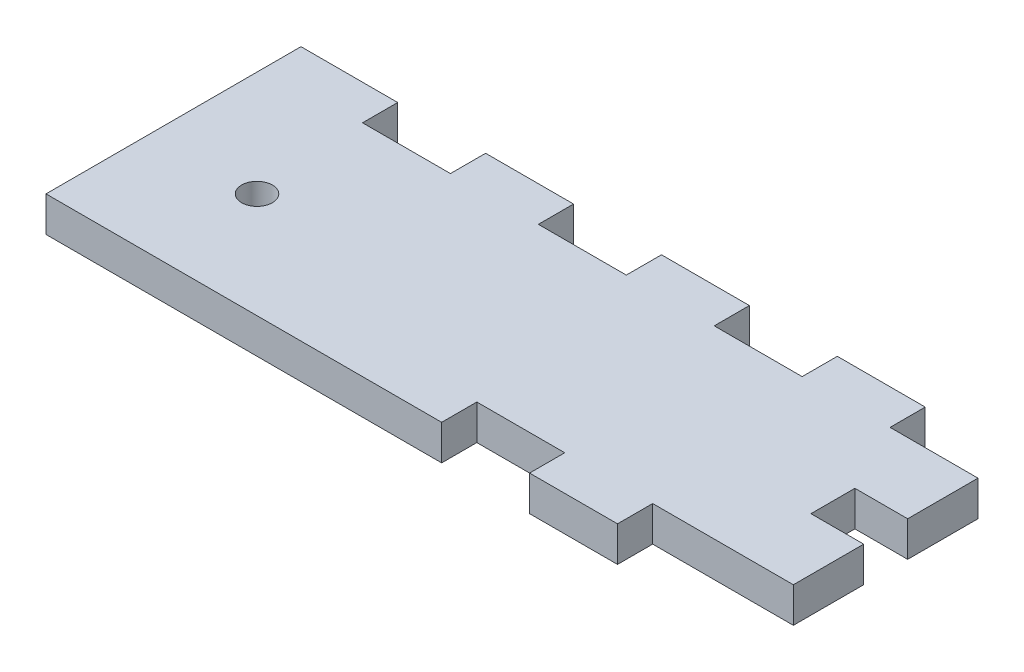
ISO-10303-21;
HEADER;
FILE_DESCRIPTION(('STEP AP214'),'2;1');
FILE_NAME('part.step','',(''),(''),'','','');
FILE_SCHEMA(('AUTOMOTIVE_DESIGN { 1 0 10303 214 1 1 1 1 }'));
ENDSEC;
DATA;
#1=APPLICATION_CONTEXT('core data for automotive mechanical design processes');
#2=APPLICATION_PROTOCOL_DEFINITION('international standard','automotive_design',2000,#1);
#3=PRODUCT_CONTEXT('',#1,'mechanical');
#4=PRODUCT('Part','Part','',(#3));
#5=PRODUCT_RELATED_PRODUCT_CATEGORY('part','',(#4));
#6=PRODUCT_DEFINITION_FORMATION('','',#4);
#7=PRODUCT_DEFINITION_CONTEXT('part definition',#1,'design');
#8=PRODUCT_DEFINITION('design','',#6,#7);
#9=PRODUCT_DEFINITION_SHAPE('','',#8);
#10=(LENGTH_UNIT() NAMED_UNIT(*) SI_UNIT(.MILLI.,.METRE.));
#11=(NAMED_UNIT(*) PLANE_ANGLE_UNIT() SI_UNIT($,.RADIAN.));
#12=(NAMED_UNIT(*) SI_UNIT($,.STERADIAN.) SOLID_ANGLE_UNIT());
#13=UNCERTAINTY_MEASURE_WITH_UNIT(LENGTH_MEASURE(1.E-05),#10,'distance_accuracy_value','');
#14=(GEOMETRIC_REPRESENTATION_CONTEXT(3) GLOBAL_UNCERTAINTY_ASSIGNED_CONTEXT((#13)) GLOBAL_UNIT_ASSIGNED_CONTEXT((#10,
#11,#12)) REPRESENTATION_CONTEXT('',''));
#15=CARTESIAN_POINT('',(0.,0.,0.));
#16=DIRECTION('',(0.,0.,1.));
#17=DIRECTION('',(1.,0.,0.));
#18=AXIS2_PLACEMENT_3D('',#15,#16,#17);
#19=CARTESIAN_POINT('',(0.,4.,21.));
#20=DIRECTION('',(0.,0.,-1.));
#21=DIRECTION('',(-1.,0.,0.));
#22=AXIS2_PLACEMENT_3D('',#19,#20,#21);
#23=PLANE('',#22);
#24=DIRECTION('',(1.,0.,0.));
#25=VECTOR('',#24,1.);
#26=CARTESIAN_POINT('',(0.,0.,21.));
#27=LINE('',#26,#25);
#28=CARTESIAN_POINT('',(45.,0.,21.));
#29=VERTEX_POINT('',#28);
#30=CARTESIAN_POINT('',(55.,0.,21.));
#31=VERTEX_POINT('',#30);
#32=EDGE_CURVE('E430',#29,#31,#27,.T.);
#33=ORIENTED_EDGE('',*,*,#32,.T.);
#34=DIRECTION('',(0.,1.,0.));
#35=VECTOR('',#34,1.);
#36=CARTESIAN_POINT('',(55.,0.,21.));
#37=LINE('',#36,#35);
#38=CARTESIAN_POINT('',(55.,4.,21.));
#39=VERTEX_POINT('',#38);
#40=EDGE_CURVE('E61',#31,#39,#37,.T.);
#41=ORIENTED_EDGE('',*,*,#40,.T.);
#42=DIRECTION('',(1.,0.,0.));
#43=VECTOR('',#42,1.);
#44=CARTESIAN_POINT('',(0.,4.,21.));
#45=LINE('',#44,#43);
#46=CARTESIAN_POINT('',(45.,4.,21.));
#47=VERTEX_POINT('',#46);
#48=EDGE_CURVE('E423',#47,#39,#45,.T.);
#49=ORIENTED_EDGE('',*,*,#48,.F.);
#50=DIRECTION('',(0.,1.,0.));
#51=VECTOR('',#50,1.);
#52=CARTESIAN_POINT('',(45.,0.,21.));
#53=LINE('',#52,#51);
#54=EDGE_CURVE('E276',#29,#47,#53,.T.);
#55=ORIENTED_EDGE('',*,*,#54,.F.);
#56=EDGE_LOOP('',(#33,#41,#49,#55));
#57=FACE_BOUND('',#56,.T.);
#58=ADVANCED_FACE('F35',(#57),#23,.F.);
#59=CARTESIAN_POINT('',(65.,4.,21.));
#60=VERTEX_POINT('',#59);
#61=CARTESIAN_POINT('',(81.,4.,21.));
#62=VERTEX_POINT('',#61);
#63=EDGE_CURVE('E53',#60,#62,#45,.T.);
#64=ORIENTED_EDGE('',*,*,#63,.F.);
#65=DIRECTION('',(0.,1.,0.));
#66=VECTOR('',#65,1.);
#67=CARTESIAN_POINT('',(65.,0.,21.));
#68=LINE('',#67,#66);
#69=CARTESIAN_POINT('',(65.,0.,21.));
#70=VERTEX_POINT('',#69);
#71=EDGE_CURVE('E261',#70,#60,#68,.T.);
#72=ORIENTED_EDGE('',*,*,#71,.F.);
#73=CARTESIAN_POINT('',(81.,0.,21.));
#74=VERTEX_POINT('',#73);
#75=EDGE_CURVE('E429',#70,#74,#27,.T.);
#76=ORIENTED_EDGE('',*,*,#75,.T.);
#77=DIRECTION('',(0.,-1.,0.));
#78=VECTOR('',#77,1.);
#79=CARTESIAN_POINT('',(81.,4.,21.));
#80=LINE('',#79,#78);
#81=EDGE_CURVE('E402',#62,#74,#80,.T.);
#82=ORIENTED_EDGE('',*,*,#81,.F.);
#83=EDGE_LOOP('',(#64,#72,#76,#82));
#84=FACE_BOUND('',#83,.T.);
#85=ADVANCED_FACE('F516',(#84),#23,.F.);
#86=CARTESIAN_POINT('',(0.,4.,0.));
#87=DIRECTION('',(0.,0.,1.));
#88=DIRECTION('',(1.,0.,0.));
#89=AXIS2_PLACEMENT_3D('',#86,#87,#88);
#90=PLANE('',#89);
#91=DIRECTION('',(-1.,0.,0.));
#92=VECTOR('',#91,1.);
#93=CARTESIAN_POINT('',(0.,0.,0.));
#94=LINE('',#93,#92);
#95=CARTESIAN_POINT('',(21.,0.,0.));
#96=VERTEX_POINT('',#95);
#97=CARTESIAN_POINT('',(11.,0.,0.));
#98=VERTEX_POINT('',#97);
#99=EDGE_CURVE('E432',#96,#98,#94,.T.);
#100=ORIENTED_EDGE('',*,*,#99,.T.);
#101=DIRECTION('',(0.,1.,0.));
#102=VECTOR('',#101,1.);
#103=CARTESIAN_POINT('',(11.,0.,0.));
#104=LINE('',#103,#102);
#105=CARTESIAN_POINT('',(11.,4.,0.));
#106=VERTEX_POINT('',#105);
#107=EDGE_CURVE('E299',#98,#106,#104,.T.);
#108=ORIENTED_EDGE('',*,*,#107,.T.);
#109=DIRECTION('',(-1.,0.,0.));
#110=VECTOR('',#109,1.);
#111=CARTESIAN_POINT('',(0.,4.,0.));
#112=LINE('',#111,#110);
#113=CARTESIAN_POINT('',(21.,4.,0.));
#114=VERTEX_POINT('',#113);
#115=EDGE_CURVE('E46',#114,#106,#112,.T.);
#116=ORIENTED_EDGE('',*,*,#115,.F.);
#117=DIRECTION('',(0.,1.,0.));
#118=VECTOR('',#117,1.);
#119=CARTESIAN_POINT('',(21.,0.,0.));
#120=LINE('',#119,#118);
#121=EDGE_CURVE('E324',#96,#114,#120,.T.);
#122=ORIENTED_EDGE('',*,*,#121,.F.);
#123=EDGE_LOOP('',(#100,#108,#116,#122));
#124=FACE_BOUND('',#123,.T.);
#125=ADVANCED_FACE('F490',(#124),#90,.F.);
#126=CARTESIAN_POINT('',(41.,0.,0.));
#127=VERTEX_POINT('',#126);
#128=CARTESIAN_POINT('',(31.,0.,0.));
#129=VERTEX_POINT('',#128);
#130=EDGE_CURVE('E435',#127,#129,#94,.T.);
#131=ORIENTED_EDGE('',*,*,#130,.T.);
#132=DIRECTION('',(0.,1.,0.));
#133=VECTOR('',#132,1.);
#134=CARTESIAN_POINT('',(31.,0.,0.));
#135=LINE('',#134,#133);
#136=CARTESIAN_POINT('',(31.,4.,0.));
#137=VERTEX_POINT('',#136);
#138=EDGE_CURVE('E321',#129,#137,#135,.T.);
#139=ORIENTED_EDGE('',*,*,#138,.T.);
#140=CARTESIAN_POINT('',(41.,4.,0.));
#141=VERTEX_POINT('',#140);
#142=EDGE_CURVE('E464',#141,#137,#112,.T.);
#143=ORIENTED_EDGE('',*,*,#142,.F.);
#144=DIRECTION('',(0.,1.,0.));
#145=VECTOR('',#144,1.);
#146=CARTESIAN_POINT('',(41.,0.,0.));
#147=LINE('',#146,#145);
#148=EDGE_CURVE('E351',#127,#141,#147,.T.);
#149=ORIENTED_EDGE('',*,*,#148,.F.);
#150=EDGE_LOOP('',(#131,#139,#143,#149));
#151=FACE_BOUND('',#150,.T.);
#152=ADVANCED_FACE('F501',(#151),#90,.F.);
#153=CARTESIAN_POINT('',(61.,0.,0.));
#154=VERTEX_POINT('',#153);
#155=CARTESIAN_POINT('',(51.,0.,0.));
#156=VERTEX_POINT('',#155);
#157=EDGE_CURVE('E439',#154,#156,#94,.T.);
#158=ORIENTED_EDGE('',*,*,#157,.T.);
#159=DIRECTION('',(0.,1.,0.));
#160=VECTOR('',#159,1.);
#161=CARTESIAN_POINT('',(51.,0.,0.));
#162=LINE('',#161,#160);
#163=CARTESIAN_POINT('',(51.,4.,0.));
#164=VERTEX_POINT('',#163);
#165=EDGE_CURVE('E348',#156,#164,#162,.T.);
#166=ORIENTED_EDGE('',*,*,#165,.T.);
#167=CARTESIAN_POINT('',(61.,4.,0.));
#168=VERTEX_POINT('',#167);
#169=EDGE_CURVE('E44',#168,#164,#112,.T.);
#170=ORIENTED_EDGE('',*,*,#169,.F.);
#171=DIRECTION('',(0.,1.,0.));
#172=VECTOR('',#171,1.);
#173=CARTESIAN_POINT('',(61.,0.,0.));
#174=LINE('',#173,#172);
#175=EDGE_CURVE('E378',#154,#168,#174,.T.);
#176=ORIENTED_EDGE('',*,*,#175,.F.);
#177=EDGE_LOOP('',(#158,#166,#170,#176));
#178=FACE_BOUND('',#177,.T.);
#179=ADVANCED_FACE('F447',(#178),#90,.F.);
#180=CARTESIAN_POINT('',(75.,4.,0.));
#181=DIRECTION('',(-1.,0.,0.));
#182=DIRECTION('',(0.,0.,1.));
#183=AXIS2_PLACEMENT_3D('',#180,#181,#182);
#184=PLANE('',#183);
#185=DIRECTION('',(0.,-1.,0.));
#186=VECTOR('',#185,1.);
#187=CARTESIAN_POINT('',(75.,4.,8.));
#188=LINE('',#187,#186);
#189=CARTESIAN_POINT('',(75.,4.,8.));
#190=VERTEX_POINT('',#189);
#191=CARTESIAN_POINT('',(75.,0.,8.));
#192=VERTEX_POINT('',#191);
#193=EDGE_CURVE('E377',#190,#192,#188,.T.);
#194=ORIENTED_EDGE('',*,*,#193,.F.);
#195=DIRECTION('',(0.,0.,-1.));
#196=VECTOR('',#195,1.);
#197=CARTESIAN_POINT('',(75.,4.,0.));
#198=LINE('',#197,#196);
#199=CARTESIAN_POINT('',(75.,4.,13.));
#200=VERTEX_POINT('',#199);
#201=EDGE_CURVE('E425',#200,#190,#198,.T.);
#202=ORIENTED_EDGE('',*,*,#201,.F.);
#203=DIRECTION('',(0.,1.,0.));
#204=VECTOR('',#203,1.);
#205=CARTESIAN_POINT('',(75.,4.,13.));
#206=LINE('',#205,#204);
#207=CARTESIAN_POINT('',(75.,0.,13.));
#208=VERTEX_POINT('',#207);
#209=EDGE_CURVE('E401',#208,#200,#206,.T.);
#210=ORIENTED_EDGE('',*,*,#209,.F.);
#211=DIRECTION('',(0.,0.,-1.));
#212=VECTOR('',#211,1.);
#213=CARTESIAN_POINT('',(75.,0.,0.));
#214=LINE('',#213,#212);
#215=EDGE_CURVE('E431',#208,#192,#214,.T.);
#216=ORIENTED_EDGE('',*,*,#215,.T.);
#217=EDGE_LOOP('',(#194,#202,#210,#216));
#218=FACE_BOUND('',#217,.T.);
#219=ADVANCED_FACE('F522',(#218),#184,.F.);
#220=CARTESIAN_POINT('',(0.,4.,0.));
#221=DIRECTION('',(1.,0.,0.));
#222=DIRECTION('',(0.,0.,-1.));
#223=AXIS2_PLACEMENT_3D('',#220,#221,#222);
#224=PLANE('',#223);
#225=DIRECTION('',(0.,0.,1.));
#226=VECTOR('',#225,1.);
#227=CARTESIAN_POINT('',(0.,0.,0.));
#228=LINE('',#227,#226);
#229=CARTESIAN_POINT('',(0.,0.,-4.));
#230=VERTEX_POINT('',#229);
#231=CARTESIAN_POINT('',(0.,0.,25.));
#232=VERTEX_POINT('',#231);
#233=EDGE_CURVE('E420',#230,#232,#228,.T.);
#234=ORIENTED_EDGE('',*,*,#233,.T.);
#235=DIRECTION('',(0.,1.,0.));
#236=VECTOR('',#235,1.);
#237=CARTESIAN_POINT('',(0.,0.,25.));
#238=LINE('',#237,#236);
#239=CARTESIAN_POINT('',(0.,4.,25.));
#240=VERTEX_POINT('',#239);
#241=EDGE_CURVE('E271',#232,#240,#238,.T.);
#242=ORIENTED_EDGE('',*,*,#241,.T.);
#243=DIRECTION('',(0.,0.,1.));
#244=VECTOR('',#243,1.);
#245=CARTESIAN_POINT('',(0.,4.,0.));
#246=LINE('',#245,#244);
#247=CARTESIAN_POINT('',(0.,4.,-4.));
#248=VERTEX_POINT('',#247);
#249=EDGE_CURVE('E421',#248,#240,#246,.T.);
#250=ORIENTED_EDGE('',*,*,#249,.F.);
#251=DIRECTION('',(0.,1.,0.));
#252=VECTOR('',#251,1.);
#253=CARTESIAN_POINT('',(0.,0.,-4.));
#254=LINE('',#253,#252);
#255=EDGE_CURVE('E279',#230,#248,#254,.T.);
#256=ORIENTED_EDGE('',*,*,#255,.F.);
#257=EDGE_LOOP('',(#234,#242,#250,#256));
#258=FACE_BOUND('',#257,.T.);
#259=ADVANCED_FACE('F37',(#258),#224,.F.);
#260=CARTESIAN_POINT('',(81.,0.,0.));
#261=VERTEX_POINT('',#260);
#262=CARTESIAN_POINT('',(71.,0.,0.));
#263=VERTEX_POINT('',#262);
#264=EDGE_CURVE('E39',#261,#263,#94,.T.);
#265=ORIENTED_EDGE('',*,*,#264,.T.);
#266=DIRECTION('',(0.,1.,0.));
#267=VECTOR('',#266,1.);
#268=CARTESIAN_POINT('',(71.,0.,0.));
#269=LINE('',#268,#267);
#270=CARTESIAN_POINT('',(71.,4.,0.));
#271=VERTEX_POINT('',#270);
#272=EDGE_CURVE('E374',#263,#271,#269,.T.);
#273=ORIENTED_EDGE('',*,*,#272,.T.);
#274=CARTESIAN_POINT('',(81.,4.,0.));
#275=VERTEX_POINT('',#274);
#276=EDGE_CURVE('E11',#275,#271,#112,.T.);
#277=ORIENTED_EDGE('',*,*,#276,.F.);
#278=DIRECTION('',(0.,1.,0.));
#279=VECTOR('',#278,1.);
#280=CARTESIAN_POINT('',(81.,4.,0.));
#281=LINE('',#280,#279);
#282=EDGE_CURVE('E383',#261,#275,#281,.T.);
#283=ORIENTED_EDGE('',*,*,#282,.F.);
#284=EDGE_LOOP('',(#265,#273,#277,#283));
#285=FACE_BOUND('',#284,.T.);
#286=ADVANCED_FACE('F525',(#285),#90,.F.);
#287=CARTESIAN_POINT('',(0.,4.,0.));
#288=DIRECTION('',(0.,1.,0.));
#289=DIRECTION('',(0.,0.,1.));
#290=AXIS2_PLACEMENT_3D('',#287,#288,#289);
#291=PLANE('',#290);
#292=CARTESIAN_POINT('',(12.,4.,13.));
#293=DIRECTION('',(0.,1.,0.));
#294=DIRECTION('',(0.,0.,1.));
#295=AXIS2_PLACEMENT_3D('',#292,#293,#294);
#296=CIRCLE('',#295,1.75);
#297=CARTESIAN_POINT('',(12.,4.,14.75));
#298=VERTEX_POINT('',#297);
#299=EDGE_CURVE('E251',#298,#298,#296,.T.);
#300=ORIENTED_EDGE('',*,*,#299,.F.);
#301=EDGE_LOOP('',(#300));
#302=FACE_BOUND('',#301,.T.);
#303=DIRECTION('',(-1.,0.,0.));
#304=VECTOR('',#303,1.);
#305=CARTESIAN_POINT('',(11.,4.,-4.));
#306=LINE('',#305,#304);
#307=CARTESIAN_POINT('',(11.,4.,-4.));
#308=VERTEX_POINT('',#307);
#309=EDGE_CURVE('E291',#308,#248,#306,.T.);
#310=ORIENTED_EDGE('',*,*,#309,.T.);
#311=ORIENTED_EDGE('',*,*,#249,.T.);
#312=DIRECTION('',(1.,0.,0.));
#313=VECTOR('',#312,1.);
#314=CARTESIAN_POINT('',(0.,4.,25.));
#315=LINE('',#314,#313);
#316=CARTESIAN_POINT('',(45.,4.,25.));
#317=VERTEX_POINT('',#316);
#318=EDGE_CURVE('E260',#240,#317,#315,.T.);
#319=ORIENTED_EDGE('',*,*,#318,.T.);
#320=DIRECTION('',(0.,0.,-1.));
#321=VECTOR('',#320,1.);
#322=CARTESIAN_POINT('',(45.,4.,21.));
#323=LINE('',#322,#321);
#324=EDGE_CURVE('E268',#317,#47,#323,.T.);
#325=ORIENTED_EDGE('',*,*,#324,.T.);
#326=ORIENTED_EDGE('',*,*,#48,.T.);
#327=DIRECTION('',(0.,0.,1.));
#328=VECTOR('',#327,1.);
#329=CARTESIAN_POINT('',(55.,4.,25.));
#330=LINE('',#329,#328);
#331=CARTESIAN_POINT('',(55.,4.,25.));
#332=VERTEX_POINT('',#331);
#333=EDGE_CURVE('E255',#39,#332,#330,.T.);
#334=ORIENTED_EDGE('',*,*,#333,.T.);
#335=DIRECTION('',(1.,0.,0.));
#336=VECTOR('',#335,1.);
#337=CARTESIAN_POINT('',(55.,4.,25.));
#338=LINE('',#337,#336);
#339=CARTESIAN_POINT('',(65.,4.,25.));
#340=VERTEX_POINT('',#339);
#341=EDGE_CURVE('E229',#332,#340,#338,.T.);
#342=ORIENTED_EDGE('',*,*,#341,.T.);
#343=DIRECTION('',(0.,0.,-1.));
#344=VECTOR('',#343,1.);
#345=CARTESIAN_POINT('',(65.,4.,25.));
#346=LINE('',#345,#344);
#347=EDGE_CURVE('E246',#340,#60,#346,.T.);
#348=ORIENTED_EDGE('',*,*,#347,.T.);
#349=ORIENTED_EDGE('',*,*,#63,.T.);
#350=DIRECTION('',(0.,0.,1.));
#351=VECTOR('',#350,1.);
#352=CARTESIAN_POINT('',(81.,4.,21.));
#353=LINE('',#352,#351);
#354=CARTESIAN_POINT('',(81.,4.,13.));
#355=VERTEX_POINT('',#354);
#356=EDGE_CURVE('E409',#355,#62,#353,.T.);
#357=ORIENTED_EDGE('',*,*,#356,.F.);
#358=DIRECTION('',(-1.,0.,0.));
#359=VECTOR('',#358,1.);
#360=CARTESIAN_POINT('',(81.,4.,13.));
#361=LINE('',#360,#359);
#362=EDGE_CURVE('E412',#355,#200,#361,.T.);
#363=ORIENTED_EDGE('',*,*,#362,.T.);
#364=ORIENTED_EDGE('',*,*,#201,.T.);
#365=DIRECTION('',(-1.,0.,0.));
#366=VECTOR('',#365,1.);
#367=CARTESIAN_POINT('',(81.,4.,8.));
#368=LINE('',#367,#366);
#369=CARTESIAN_POINT('',(81.,4.,8.));
#370=VERTEX_POINT('',#369);
#371=EDGE_CURVE('E398',#370,#190,#368,.T.);
#372=ORIENTED_EDGE('',*,*,#371,.F.);
#373=DIRECTION('',(0.,0.,1.));
#374=VECTOR('',#373,1.);
#375=CARTESIAN_POINT('',(81.,4.,0.));
#376=LINE('',#375,#374);
#377=EDGE_CURVE('E386',#275,#370,#376,.T.);
#378=ORIENTED_EDGE('',*,*,#377,.F.);
#379=ORIENTED_EDGE('',*,*,#276,.T.);
#380=DIRECTION('',(0.,0.,-1.));
#381=VECTOR('',#380,1.);
#382=CARTESIAN_POINT('',(71.,4.,0.));
#383=LINE('',#382,#381);
#384=CARTESIAN_POINT('',(71.,4.,-4.));
#385=VERTEX_POINT('',#384);
#386=EDGE_CURVE('E350',#271,#385,#383,.T.);
#387=ORIENTED_EDGE('',*,*,#386,.T.);
#388=DIRECTION('',(-1.,0.,0.));
#389=VECTOR('',#388,1.);
#390=CARTESIAN_POINT('',(71.,4.,-4.));
#391=LINE('',#390,#389);
#392=CARTESIAN_POINT('',(61.,4.,-4.));
#393=VERTEX_POINT('',#392);
#394=EDGE_CURVE('E369',#385,#393,#391,.T.);
#395=ORIENTED_EDGE('',*,*,#394,.T.);
#396=DIRECTION('',(0.,0.,1.));
#397=VECTOR('',#396,1.);
#398=CARTESIAN_POINT('',(61.,4.,0.));
#399=LINE('',#398,#397);
#400=EDGE_CURVE('E361',#393,#168,#399,.T.);
#401=ORIENTED_EDGE('',*,*,#400,.T.);
#402=ORIENTED_EDGE('',*,*,#169,.T.);
#403=DIRECTION('',(0.,0.,-1.));
#404=VECTOR('',#403,1.);
#405=CARTESIAN_POINT('',(51.,4.,0.));
#406=LINE('',#405,#404);
#407=CARTESIAN_POINT('',(51.,4.,-4.));
#408=VERTEX_POINT('',#407);
#409=EDGE_CURVE('E323',#164,#408,#406,.T.);
#410=ORIENTED_EDGE('',*,*,#409,.T.);
#411=DIRECTION('',(-1.,0.,0.));
#412=VECTOR('',#411,1.);
#413=CARTESIAN_POINT('',(51.,4.,-4.));
#414=LINE('',#413,#412);
#415=CARTESIAN_POINT('',(41.,4.,-4.));
#416=VERTEX_POINT('',#415);
#417=EDGE_CURVE('E343',#408,#416,#414,.T.);
#418=ORIENTED_EDGE('',*,*,#417,.T.);
#419=DIRECTION('',(0.,0.,1.));
#420=VECTOR('',#419,1.);
#421=CARTESIAN_POINT('',(41.,4.,0.));
#422=LINE('',#421,#420);
#423=EDGE_CURVE('E334',#416,#141,#422,.T.);
#424=ORIENTED_EDGE('',*,*,#423,.T.);
#425=ORIENTED_EDGE('',*,*,#142,.T.);
#426=DIRECTION('',(0.,0.,-1.));
#427=VECTOR('',#426,1.);
#428=CARTESIAN_POINT('',(31.,4.,0.));
#429=LINE('',#428,#427);
#430=CARTESIAN_POINT('',(31.,4.,-4.));
#431=VERTEX_POINT('',#430);
#432=EDGE_CURVE('E301',#137,#431,#429,.T.);
#433=ORIENTED_EDGE('',*,*,#432,.T.);
#434=DIRECTION('',(-1.,0.,0.));
#435=VECTOR('',#434,1.);
#436=CARTESIAN_POINT('',(31.,4.,-4.));
#437=LINE('',#436,#435);
#438=CARTESIAN_POINT('',(21.,4.,-4.));
#439=VERTEX_POINT('',#438);
#440=EDGE_CURVE('E316',#431,#439,#437,.T.);
#441=ORIENTED_EDGE('',*,*,#440,.T.);
#442=DIRECTION('',(0.,0.,1.));
#443=VECTOR('',#442,1.);
#444=CARTESIAN_POINT('',(21.,4.,0.));
#445=LINE('',#444,#443);
#446=EDGE_CURVE('E307',#439,#114,#445,.T.);
#447=ORIENTED_EDGE('',*,*,#446,.T.);
#448=ORIENTED_EDGE('',*,*,#115,.T.);
#449=DIRECTION('',(0.,0.,-1.));
#450=VECTOR('',#449,1.);
#451=CARTESIAN_POINT('',(11.,4.,0.));
#452=LINE('',#451,#450);
#453=EDGE_CURVE('E286',#106,#308,#452,.T.);
#454=ORIENTED_EDGE('',*,*,#453,.T.);
#455=EDGE_LOOP('',(#310,#311,#319,#325,#326,#334,#342,#348,#349,#357,#363,#364,#372,#378,#379,
#387,#395,#401,#402,#410,#418,#424,#425,#433,#441,#447,#448,#454));
#456=FACE_BOUND('',#455,.T.);
#457=ADVANCED_FACE('F462',(#302,#456),#291,.T.);
#458=CARTESIAN_POINT('',(0.,0.,0.));
#459=DIRECTION('',(0.,1.,0.));
#460=DIRECTION('',(0.,0.,1.));
#461=AXIS2_PLACEMENT_3D('',#458,#459,#460);
#462=PLANE('',#461);
#463=CARTESIAN_POINT('',(12.,0.,13.));
#464=DIRECTION('',(0.,1.,0.));
#465=DIRECTION('',(0.,0.,1.));
#466=AXIS2_PLACEMENT_3D('',#463,#464,#465);
#467=CIRCLE('',#466,1.75);
#468=CARTESIAN_POINT('',(12.,0.,14.75));
#469=VERTEX_POINT('',#468);
#470=EDGE_CURVE('E257',#469,#469,#467,.T.);
#471=ORIENTED_EDGE('',*,*,#470,.T.);
#472=EDGE_LOOP('',(#471));
#473=FACE_BOUND('',#472,.T.);
#474=ORIENTED_EDGE('',*,*,#233,.F.);
#475=DIRECTION('',(-1.,0.,0.));
#476=VECTOR('',#475,1.);
#477=CARTESIAN_POINT('',(11.,0.,-4.));
#478=LINE('',#477,#476);
#479=CARTESIAN_POINT('',(11.,0.,-4.));
#480=VERTEX_POINT('',#479);
#481=EDGE_CURVE('E290',#480,#230,#478,.T.);
#482=ORIENTED_EDGE('',*,*,#481,.F.);
#483=DIRECTION('',(0.,0.,-1.));
#484=VECTOR('',#483,1.);
#485=CARTESIAN_POINT('',(11.,0.,0.));
#486=LINE('',#485,#484);
#487=EDGE_CURVE('E287',#98,#480,#486,.T.);
#488=ORIENTED_EDGE('',*,*,#487,.F.);
#489=ORIENTED_EDGE('',*,*,#99,.F.);
#490=DIRECTION('',(0.,0.,1.));
#491=VECTOR('',#490,1.);
#492=CARTESIAN_POINT('',(21.,0.,0.));
#493=LINE('',#492,#491);
#494=CARTESIAN_POINT('',(21.,0.,-4.));
#495=VERTEX_POINT('',#494);
#496=EDGE_CURVE('E310',#495,#96,#493,.T.);
#497=ORIENTED_EDGE('',*,*,#496,.F.);
#498=DIRECTION('',(-1.,0.,0.));
#499=VECTOR('',#498,1.);
#500=CARTESIAN_POINT('',(31.,0.,-4.));
#501=LINE('',#500,#499);
#502=CARTESIAN_POINT('',(31.,0.,-4.));
#503=VERTEX_POINT('',#502);
#504=EDGE_CURVE('E306',#503,#495,#501,.T.);
#505=ORIENTED_EDGE('',*,*,#504,.F.);
#506=DIRECTION('',(0.,0.,-1.));
#507=VECTOR('',#506,1.);
#508=CARTESIAN_POINT('',(31.,0.,0.));
#509=LINE('',#508,#507);
#510=EDGE_CURVE('E303',#129,#503,#509,.T.);
#511=ORIENTED_EDGE('',*,*,#510,.F.);
#512=ORIENTED_EDGE('',*,*,#130,.F.);
#513=DIRECTION('',(0.,0.,1.));
#514=VECTOR('',#513,1.);
#515=CARTESIAN_POINT('',(41.,0.,0.));
#516=LINE('',#515,#514);
#517=CARTESIAN_POINT('',(41.,0.,-4.));
#518=VERTEX_POINT('',#517);
#519=EDGE_CURVE('E337',#518,#127,#516,.T.);
#520=ORIENTED_EDGE('',*,*,#519,.F.);
#521=DIRECTION('',(-1.,0.,0.));
#522=VECTOR('',#521,1.);
#523=CARTESIAN_POINT('',(51.,0.,-4.));
#524=LINE('',#523,#522);
#525=CARTESIAN_POINT('',(51.,0.,-4.));
#526=VERTEX_POINT('',#525);
#527=EDGE_CURVE('E333',#526,#518,#524,.T.);
#528=ORIENTED_EDGE('',*,*,#527,.F.);
#529=DIRECTION('',(0.,0.,-1.));
#530=VECTOR('',#529,1.);
#531=CARTESIAN_POINT('',(51.,0.,0.));
#532=LINE('',#531,#530);
#533=EDGE_CURVE('E330',#156,#526,#532,.T.);
#534=ORIENTED_EDGE('',*,*,#533,.F.);
#535=ORIENTED_EDGE('',*,*,#157,.F.);
#536=DIRECTION('',(0.,0.,1.));
#537=VECTOR('',#536,1.);
#538=CARTESIAN_POINT('',(61.,0.,0.));
#539=LINE('',#538,#537);
#540=CARTESIAN_POINT('',(61.,0.,-4.));
#541=VERTEX_POINT('',#540);
#542=EDGE_CURVE('E364',#541,#154,#539,.T.);
#543=ORIENTED_EDGE('',*,*,#542,.F.);
#544=DIRECTION('',(-1.,0.,0.));
#545=VECTOR('',#544,1.);
#546=CARTESIAN_POINT('',(71.,0.,-4.));
#547=LINE('',#546,#545);
#548=CARTESIAN_POINT('',(71.,0.,-4.));
#549=VERTEX_POINT('',#548);
#550=EDGE_CURVE('E360',#549,#541,#547,.T.);
#551=ORIENTED_EDGE('',*,*,#550,.F.);
#552=DIRECTION('',(0.,0.,-1.));
#553=VECTOR('',#552,1.);
#554=CARTESIAN_POINT('',(71.,0.,0.));
#555=LINE('',#554,#553);
#556=EDGE_CURVE('E357',#263,#549,#555,.T.);
#557=ORIENTED_EDGE('',*,*,#556,.F.);
#558=ORIENTED_EDGE('',*,*,#264,.F.);
#559=DIRECTION('',(0.,0.,-1.));
#560=VECTOR('',#559,1.);
#561=CARTESIAN_POINT('',(81.,0.,0.));
#562=LINE('',#561,#560);
#563=CARTESIAN_POINT('',(81.,0.,8.));
#564=VERTEX_POINT('',#563);
#565=EDGE_CURVE('E390',#564,#261,#562,.T.);
#566=ORIENTED_EDGE('',*,*,#565,.F.);
#567=DIRECTION('',(-1.,0.,0.));
#568=VECTOR('',#567,1.);
#569=CARTESIAN_POINT('',(81.,0.,8.));
#570=LINE('',#569,#568);
#571=EDGE_CURVE('E393',#564,#192,#570,.T.);
#572=ORIENTED_EDGE('',*,*,#571,.T.);
#573=ORIENTED_EDGE('',*,*,#215,.F.);
#574=DIRECTION('',(-1.,0.,0.));
#575=VECTOR('',#574,1.);
#576=CARTESIAN_POINT('',(81.,0.,13.));
#577=LINE('',#576,#575);
#578=CARTESIAN_POINT('',(81.,0.,13.));
#579=VERTEX_POINT('',#578);
#580=EDGE_CURVE('E417',#579,#208,#577,.T.);
#581=ORIENTED_EDGE('',*,*,#580,.F.);
#582=DIRECTION('',(0.,0.,-1.));
#583=VECTOR('',#582,1.);
#584=CARTESIAN_POINT('',(81.,0.,21.));
#585=LINE('',#584,#583);
#586=EDGE_CURVE('E405',#74,#579,#585,.T.);
#587=ORIENTED_EDGE('',*,*,#586,.F.);
#588=ORIENTED_EDGE('',*,*,#75,.F.);
#589=DIRECTION('',(0.,0.,-1.));
#590=VECTOR('',#589,1.);
#591=CARTESIAN_POINT('',(65.,0.,25.));
#592=LINE('',#591,#590);
#593=CARTESIAN_POINT('',(65.,0.,25.));
#594=VERTEX_POINT('',#593);
#595=EDGE_CURVE('E235',#594,#70,#592,.T.);
#596=ORIENTED_EDGE('',*,*,#595,.F.);
#597=DIRECTION('',(1.,0.,0.));
#598=VECTOR('',#597,1.);
#599=CARTESIAN_POINT('',(55.,0.,25.));
#600=LINE('',#599,#598);
#601=CARTESIAN_POINT('',(55.,0.,25.));
#602=VERTEX_POINT('',#601);
#603=EDGE_CURVE('E227',#602,#594,#600,.T.);
#604=ORIENTED_EDGE('',*,*,#603,.F.);
#605=DIRECTION('',(0.,0.,1.));
#606=VECTOR('',#605,1.);
#607=CARTESIAN_POINT('',(55.,0.,25.));
#608=LINE('',#607,#606);
#609=EDGE_CURVE('E242',#31,#602,#608,.T.);
#610=ORIENTED_EDGE('',*,*,#609,.F.);
#611=ORIENTED_EDGE('',*,*,#32,.F.);
#612=DIRECTION('',(0.,0.,-1.));
#613=VECTOR('',#612,1.);
#614=CARTESIAN_POINT('',(45.,0.,21.));
#615=LINE('',#614,#613);
#616=CARTESIAN_POINT('',(45.,0.,25.));
#617=VERTEX_POINT('',#616);
#618=EDGE_CURVE('E267',#617,#29,#615,.T.);
#619=ORIENTED_EDGE('',*,*,#618,.F.);
#620=DIRECTION('',(1.,0.,0.));
#621=VECTOR('',#620,1.);
#622=CARTESIAN_POINT('',(0.,0.,25.));
#623=LINE('',#622,#621);
#624=EDGE_CURVE('E264',#232,#617,#623,.T.);
#625=ORIENTED_EDGE('',*,*,#624,.F.);
#626=EDGE_LOOP('',(#474,#482,#488,#489,#497,#505,#511,#512,#520,#528,#534,#535,#543,#551,#557,
#558,#566,#572,#573,#581,#587,#588,#596,#604,#610,#611,#619,#625));
#627=FACE_BOUND('',#626,.T.);
#628=ADVANCED_FACE('F240',(#473,#627),#462,.F.);
#629=CARTESIAN_POINT('',(81.,4.,13.));
#630=DIRECTION('',(0.,0.,1.));
#631=DIRECTION('',(1.,0.,0.));
#632=AXIS2_PLACEMENT_3D('',#629,#630,#631);
#633=PLANE('',#632);
#634=ORIENTED_EDGE('',*,*,#209,.T.);
#635=ORIENTED_EDGE('',*,*,#362,.F.);
#636=DIRECTION('',(0.,1.,0.));
#637=VECTOR('',#636,1.);
#638=CARTESIAN_POINT('',(81.,4.,13.));
#639=LINE('',#638,#637);
#640=EDGE_CURVE('E407',#579,#355,#639,.T.);
#641=ORIENTED_EDGE('',*,*,#640,.F.);
#642=ORIENTED_EDGE('',*,*,#580,.T.);
#643=EDGE_LOOP('',(#634,#635,#641,#642));
#644=FACE_BOUND('',#643,.T.);
#645=ADVANCED_FACE('F530',(#644),#633,.F.);
#646=CARTESIAN_POINT('',(81.,0.,0.));
#647=DIRECTION('',(1.,0.,0.));
#648=DIRECTION('',(0.,0.,-1.));
#649=AXIS2_PLACEMENT_3D('',#646,#647,#648);
#650=PLANE('',#649);
#651=ORIENTED_EDGE('',*,*,#81,.T.);
#652=ORIENTED_EDGE('',*,*,#586,.T.);
#653=ORIENTED_EDGE('',*,*,#640,.T.);
#654=ORIENTED_EDGE('',*,*,#356,.T.);
#655=EDGE_LOOP('',(#651,#652,#653,#654));
#656=FACE_BOUND('',#655,.T.);
#657=ADVANCED_FACE('F537',(#656),#650,.T.);
#658=CARTESIAN_POINT('',(81.,4.,8.));
#659=DIRECTION('',(0.,0.,-1.));
#660=DIRECTION('',(-1.,0.,0.));
#661=AXIS2_PLACEMENT_3D('',#658,#659,#660);
#662=PLANE('',#661);
#663=ORIENTED_EDGE('',*,*,#193,.T.);
#664=ORIENTED_EDGE('',*,*,#571,.F.);
#665=DIRECTION('',(0.,-1.,0.));
#666=VECTOR('',#665,1.);
#667=CARTESIAN_POINT('',(81.,4.,8.));
#668=LINE('',#667,#666);
#669=EDGE_CURVE('E388',#370,#564,#668,.T.);
#670=ORIENTED_EDGE('',*,*,#669,.F.);
#671=ORIENTED_EDGE('',*,*,#371,.T.);
#672=EDGE_LOOP('',(#663,#664,#670,#671));
#673=FACE_BOUND('',#672,.T.);
#674=ADVANCED_FACE('F541',(#673),#662,.F.);
#675=CARTESIAN_POINT('',(81.,0.,0.));
#676=DIRECTION('',(-1.,0.,0.));
#677=DIRECTION('',(0.,0.,1.));
#678=AXIS2_PLACEMENT_3D('',#675,#676,#677);
#679=PLANE('',#678);
#680=ORIENTED_EDGE('',*,*,#282,.T.);
#681=ORIENTED_EDGE('',*,*,#377,.T.);
#682=ORIENTED_EDGE('',*,*,#669,.T.);
#683=ORIENTED_EDGE('',*,*,#565,.T.);
#684=EDGE_LOOP('',(#680,#681,#682,#683));
#685=FACE_BOUND('',#684,.T.);
#686=ADVANCED_FACE('F545',(#685),#679,.F.);
#687=CARTESIAN_POINT('',(71.,0.,0.));
#688=DIRECTION('',(1.,0.,0.));
#689=DIRECTION('',(0.,0.,-1.));
#690=AXIS2_PLACEMENT_3D('',#687,#688,#689);
#691=PLANE('',#690);
#692=ORIENTED_EDGE('',*,*,#386,.F.);
#693=ORIENTED_EDGE('',*,*,#272,.F.);
#694=ORIENTED_EDGE('',*,*,#556,.T.);
#695=DIRECTION('',(0.,1.,0.));
#696=VECTOR('',#695,1.);
#697=CARTESIAN_POINT('',(71.,0.,-4.));
#698=LINE('',#697,#696);
#699=EDGE_CURVE('E366',#549,#385,#698,.T.);
#700=ORIENTED_EDGE('',*,*,#699,.T.);
#701=EDGE_LOOP('',(#692,#693,#694,#700));
#702=FACE_BOUND('',#701,.T.);
#703=ADVANCED_FACE('F549',(#702),#691,.T.);
#704=CARTESIAN_POINT('',(61.,0.,0.));
#705=DIRECTION('',(-1.,0.,0.));
#706=DIRECTION('',(0.,0.,1.));
#707=AXIS2_PLACEMENT_3D('',#704,#705,#706);
#708=PLANE('',#707);
#709=ORIENTED_EDGE('',*,*,#400,.F.);
#710=DIRECTION('',(0.,1.,0.));
#711=VECTOR('',#710,1.);
#712=CARTESIAN_POINT('',(61.,0.,-4.));
#713=LINE('',#712,#711);
#714=EDGE_CURVE('E380',#541,#393,#713,.T.);
#715=ORIENTED_EDGE('',*,*,#714,.F.);
#716=ORIENTED_EDGE('',*,*,#542,.T.);
#717=ORIENTED_EDGE('',*,*,#175,.T.);
#718=EDGE_LOOP('',(#709,#715,#716,#717));
#719=FACE_BOUND('',#718,.T.);
#720=ADVANCED_FACE('F553',(#719),#708,.T.);
#721=CARTESIAN_POINT('',(71.,0.,-4.));
#722=DIRECTION('',(0.,0.,-1.));
#723=DIRECTION('',(-1.,0.,0.));
#724=AXIS2_PLACEMENT_3D('',#721,#722,#723);
#725=PLANE('',#724);
#726=ORIENTED_EDGE('',*,*,#394,.F.);
#727=ORIENTED_EDGE('',*,*,#699,.F.);
#728=ORIENTED_EDGE('',*,*,#550,.T.);
#729=ORIENTED_EDGE('',*,*,#714,.T.);
#730=EDGE_LOOP('',(#726,#727,#728,#729));
#731=FACE_BOUND('',#730,.T.);
#732=ADVANCED_FACE('F512',(#731),#725,.T.);
#733=CARTESIAN_POINT('',(51.,0.,0.));
#734=DIRECTION('',(1.,0.,0.));
#735=DIRECTION('',(0.,0.,-1.));
#736=AXIS2_PLACEMENT_3D('',#733,#734,#735);
#737=PLANE('',#736);
#738=ORIENTED_EDGE('',*,*,#409,.F.);
#739=ORIENTED_EDGE('',*,*,#165,.F.);
#740=ORIENTED_EDGE('',*,*,#533,.T.);
#741=DIRECTION('',(0.,1.,0.));
#742=VECTOR('',#741,1.);
#743=CARTESIAN_POINT('',(51.,0.,-4.));
#744=LINE('',#743,#742);
#745=EDGE_CURVE('E340',#526,#408,#744,.T.);
#746=ORIENTED_EDGE('',*,*,#745,.T.);
#747=EDGE_LOOP('',(#738,#739,#740,#746));
#748=FACE_BOUND('',#747,.T.);
#749=ADVANCED_FACE('F454',(#748),#737,.T.);
#750=CARTESIAN_POINT('',(41.,0.,0.));
#751=DIRECTION('',(-1.,0.,0.));
#752=DIRECTION('',(0.,0.,1.));
#753=AXIS2_PLACEMENT_3D('',#750,#751,#752);
#754=PLANE('',#753);
#755=ORIENTED_EDGE('',*,*,#423,.F.);
#756=DIRECTION('',(0.,1.,0.));
#757=VECTOR('',#756,1.);
#758=CARTESIAN_POINT('',(41.,0.,-4.));
#759=LINE('',#758,#757);
#760=EDGE_CURVE('E354',#518,#416,#759,.T.);
#761=ORIENTED_EDGE('',*,*,#760,.F.);
#762=ORIENTED_EDGE('',*,*,#519,.T.);
#763=ORIENTED_EDGE('',*,*,#148,.T.);
#764=EDGE_LOOP('',(#755,#761,#762,#763));
#765=FACE_BOUND('',#764,.T.);
#766=ADVANCED_FACE('F504',(#765),#754,.T.);
#767=CARTESIAN_POINT('',(51.,0.,-4.));
#768=DIRECTION('',(0.,0.,-1.));
#769=DIRECTION('',(-1.,0.,0.));
#770=AXIS2_PLACEMENT_3D('',#767,#768,#769);
#771=PLANE('',#770);
#772=ORIENTED_EDGE('',*,*,#417,.F.);
#773=ORIENTED_EDGE('',*,*,#745,.F.);
#774=ORIENTED_EDGE('',*,*,#527,.T.);
#775=ORIENTED_EDGE('',*,*,#760,.T.);
#776=EDGE_LOOP('',(#772,#773,#774,#775));
#777=FACE_BOUND('',#776,.T.);
#778=ADVANCED_FACE('F459',(#777),#771,.T.);
#779=CARTESIAN_POINT('',(31.,0.,0.));
#780=DIRECTION('',(1.,0.,0.));
#781=DIRECTION('',(0.,0.,-1.));
#782=AXIS2_PLACEMENT_3D('',#779,#780,#781);
#783=PLANE('',#782);
#784=ORIENTED_EDGE('',*,*,#432,.F.);
#785=ORIENTED_EDGE('',*,*,#138,.F.);
#786=ORIENTED_EDGE('',*,*,#510,.T.);
#787=DIRECTION('',(0.,1.,0.));
#788=VECTOR('',#787,1.);
#789=CARTESIAN_POINT('',(31.,0.,-4.));
#790=LINE('',#789,#788);
#791=EDGE_CURVE('E313',#503,#431,#790,.T.);
#792=ORIENTED_EDGE('',*,*,#791,.T.);
#793=EDGE_LOOP('',(#784,#785,#786,#792));
#794=FACE_BOUND('',#793,.T.);
#795=ADVANCED_FACE('F499',(#794),#783,.T.);
#796=CARTESIAN_POINT('',(21.,0.,0.));
#797=DIRECTION('',(-1.,0.,0.));
#798=DIRECTION('',(0.,0.,1.));
#799=AXIS2_PLACEMENT_3D('',#796,#797,#798);
#800=PLANE('',#799);
#801=ORIENTED_EDGE('',*,*,#446,.F.);
#802=DIRECTION('',(0.,1.,0.));
#803=VECTOR('',#802,1.);
#804=CARTESIAN_POINT('',(21.,0.,-4.));
#805=LINE('',#804,#803);
#806=EDGE_CURVE('E327',#495,#439,#805,.T.);
#807=ORIENTED_EDGE('',*,*,#806,.F.);
#808=ORIENTED_EDGE('',*,*,#496,.T.);
#809=ORIENTED_EDGE('',*,*,#121,.T.);
#810=EDGE_LOOP('',(#801,#807,#808,#809));
#811=FACE_BOUND('',#810,.T.);
#812=ADVANCED_FACE('F492',(#811),#800,.T.);
#813=CARTESIAN_POINT('',(31.,0.,-4.));
#814=DIRECTION('',(0.,0.,-1.));
#815=DIRECTION('',(-1.,0.,0.));
#816=AXIS2_PLACEMENT_3D('',#813,#814,#815);
#817=PLANE('',#816);
#818=ORIENTED_EDGE('',*,*,#440,.F.);
#819=ORIENTED_EDGE('',*,*,#791,.F.);
#820=ORIENTED_EDGE('',*,*,#504,.T.);
#821=ORIENTED_EDGE('',*,*,#806,.T.);
#822=EDGE_LOOP('',(#818,#819,#820,#821));
#823=FACE_BOUND('',#822,.T.);
#824=ADVANCED_FACE('F495',(#823),#817,.T.);
#825=CARTESIAN_POINT('',(11.,0.,0.));
#826=DIRECTION('',(1.,0.,0.));
#827=DIRECTION('',(0.,0.,-1.));
#828=AXIS2_PLACEMENT_3D('',#825,#826,#827);
#829=PLANE('',#828);
#830=ORIENTED_EDGE('',*,*,#453,.F.);
#831=ORIENTED_EDGE('',*,*,#107,.F.);
#832=ORIENTED_EDGE('',*,*,#487,.T.);
#833=DIRECTION('',(0.,1.,0.));
#834=VECTOR('',#833,1.);
#835=CARTESIAN_POINT('',(11.,0.,-4.));
#836=LINE('',#835,#834);
#837=EDGE_CURVE('E294',#480,#308,#836,.T.);
#838=ORIENTED_EDGE('',*,*,#837,.T.);
#839=EDGE_LOOP('',(#830,#831,#832,#838));
#840=FACE_BOUND('',#839,.T.);
#841=ADVANCED_FACE('F471',(#840),#829,.T.);
#842=CARTESIAN_POINT('',(11.,0.,-4.));
#843=DIRECTION('',(0.,0.,-1.));
#844=DIRECTION('',(-1.,0.,0.));
#845=AXIS2_PLACEMENT_3D('',#842,#843,#844);
#846=PLANE('',#845);
#847=ORIENTED_EDGE('',*,*,#309,.F.);
#848=ORIENTED_EDGE('',*,*,#837,.F.);
#849=ORIENTED_EDGE('',*,*,#481,.T.);
#850=ORIENTED_EDGE('',*,*,#255,.T.);
#851=EDGE_LOOP('',(#847,#848,#849,#850));
#852=FACE_BOUND('',#851,.T.);
#853=ADVANCED_FACE('F476',(#852),#846,.T.);
#854=CARTESIAN_POINT('',(45.,0.,21.));
#855=DIRECTION('',(1.,0.,0.));
#856=DIRECTION('',(0.,0.,-1.));
#857=AXIS2_PLACEMENT_3D('',#854,#855,#856);
#858=PLANE('',#857);
#859=ORIENTED_EDGE('',*,*,#324,.F.);
#860=DIRECTION('',(0.,1.,0.));
#861=VECTOR('',#860,1.);
#862=CARTESIAN_POINT('',(45.,0.,25.));
#863=LINE('',#862,#861);
#864=EDGE_CURVE('E280',#617,#317,#863,.T.);
#865=ORIENTED_EDGE('',*,*,#864,.F.);
#866=ORIENTED_EDGE('',*,*,#618,.T.);
#867=ORIENTED_EDGE('',*,*,#54,.T.);
#868=EDGE_LOOP('',(#859,#865,#866,#867));
#869=FACE_BOUND('',#868,.T.);
#870=ADVANCED_FACE('F487',(#869),#858,.T.);
#871=CARTESIAN_POINT('',(0.,0.,25.));
#872=DIRECTION('',(0.,0.,1.));
#873=DIRECTION('',(1.,0.,0.));
#874=AXIS2_PLACEMENT_3D('',#871,#872,#873);
#875=PLANE('',#874);
#876=ORIENTED_EDGE('',*,*,#318,.F.);
#877=ORIENTED_EDGE('',*,*,#241,.F.);
#878=ORIENTED_EDGE('',*,*,#624,.T.);
#879=ORIENTED_EDGE('',*,*,#864,.T.);
#880=EDGE_LOOP('',(#876,#877,#878,#879));
#881=FACE_BOUND('',#880,.T.);
#882=ADVANCED_FACE('F483',(#881),#875,.T.);
#883=CARTESIAN_POINT('',(55.,0.,25.));
#884=DIRECTION('',(-1.,0.,0.));
#885=DIRECTION('',(0.,0.,1.));
#886=AXIS2_PLACEMENT_3D('',#883,#884,#885);
#887=PLANE('',#886);
#888=ORIENTED_EDGE('',*,*,#333,.F.);
#889=ORIENTED_EDGE('',*,*,#40,.F.);
#890=ORIENTED_EDGE('',*,*,#609,.T.);
#891=DIRECTION('',(0.,1.,0.));
#892=VECTOR('',#891,1.);
#893=CARTESIAN_POINT('',(55.,0.,25.));
#894=LINE('',#893,#892);
#895=EDGE_CURVE('E224',#602,#332,#894,.T.);
#896=ORIENTED_EDGE('',*,*,#895,.T.);
#897=EDGE_LOOP('',(#888,#889,#890,#896));
#898=FACE_BOUND('',#897,.T.);
#899=ADVANCED_FACE('F245',(#898),#887,.T.);
#900=CARTESIAN_POINT('',(65.,0.,25.));
#901=DIRECTION('',(1.,0.,0.));
#902=DIRECTION('',(0.,0.,-1.));
#903=AXIS2_PLACEMENT_3D('',#900,#901,#902);
#904=PLANE('',#903);
#905=ORIENTED_EDGE('',*,*,#347,.F.);
#906=DIRECTION('',(0.,1.,0.));
#907=VECTOR('',#906,1.);
#908=CARTESIAN_POINT('',(65.,0.,25.));
#909=LINE('',#908,#907);
#910=EDGE_CURVE('E234',#594,#340,#909,.T.);
#911=ORIENTED_EDGE('',*,*,#910,.F.);
#912=ORIENTED_EDGE('',*,*,#595,.T.);
#913=ORIENTED_EDGE('',*,*,#71,.T.);
#914=EDGE_LOOP('',(#905,#911,#912,#913));
#915=FACE_BOUND('',#914,.T.);
#916=ADVANCED_FACE('F577',(#915),#904,.T.);
#917=CARTESIAN_POINT('',(55.,0.,25.));
#918=DIRECTION('',(0.,0.,1.));
#919=DIRECTION('',(1.,0.,0.));
#920=AXIS2_PLACEMENT_3D('',#917,#918,#919);
#921=PLANE('',#920);
#922=ORIENTED_EDGE('',*,*,#341,.F.);
#923=ORIENTED_EDGE('',*,*,#895,.F.);
#924=ORIENTED_EDGE('',*,*,#603,.T.);
#925=ORIENTED_EDGE('',*,*,#910,.T.);
#926=EDGE_LOOP('',(#922,#923,#924,#925));
#927=FACE_BOUND('',#926,.T.);
#928=ADVANCED_FACE('F226',(#927),#921,.T.);
#929=CARTESIAN_POINT('',(12.,0.,13.));
#930=DIRECTION('',(0.,1.,0.));
#931=DIRECTION('',(0.,0.,1.));
#932=AXIS2_PLACEMENT_3D('',#929,#930,#931);
#933=CYLINDRICAL_SURFACE('',#932,1.75);
#934=ORIENTED_EDGE('',*,*,#470,.F.);
#935=EDGE_LOOP('',(#934));
#936=FACE_BOUND('',#935,.T.);
#937=ORIENTED_EDGE('',*,*,#299,.T.);
#938=EDGE_LOOP('',(#937));
#939=FACE_BOUND('',#938,.T.);
#940=ADVANCED_FACE('F584',(#936,#939),#933,.F.);
#941=CLOSED_SHELL('',(#58,#85,#125,#152,#179,#219,#259,#286,#457,#628,#645,#657,#674,#686,#703,
#720,#732,#749,#766,#778,#795,#812,#824,#841,#853,#870,#882,#899,#916,#928,#940));
#942=MANIFOLD_SOLID_BREP('B2',#941);
#943=ADVANCED_BREP_SHAPE_REPRESENTATION('',(#18,#942),#14);
#944=SHAPE_DEFINITION_REPRESENTATION(#9,#943);
ENDSEC;
END-ISO-10303-21;
